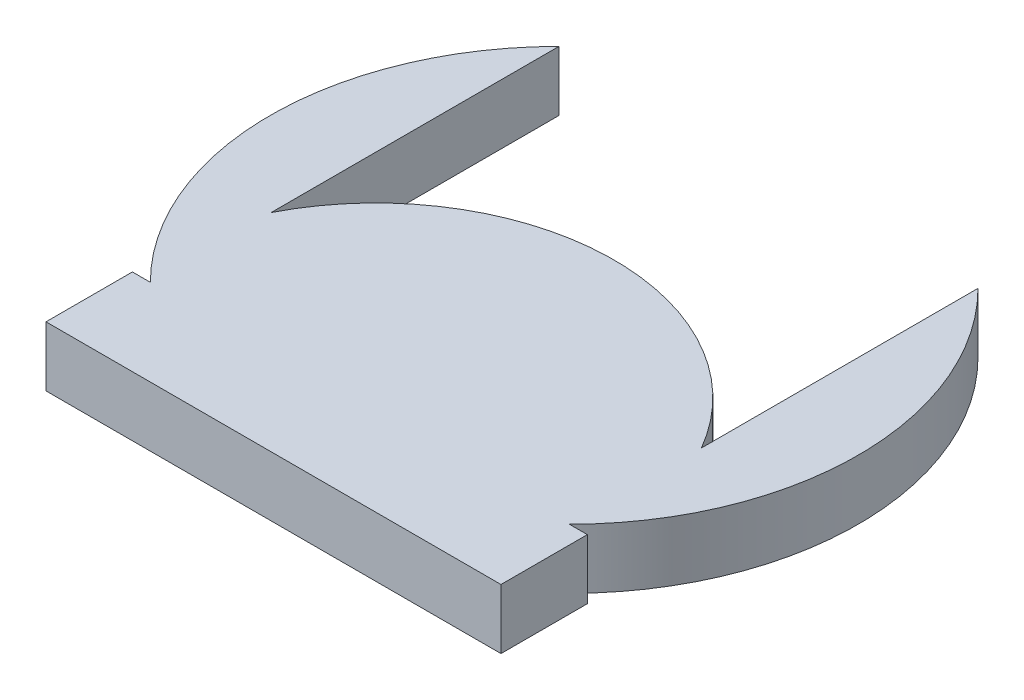
ISO-10303-21;
HEADER;
FILE_DESCRIPTION(('STEP AP214'),'2;1');
FILE_NAME('part.step','',(''),(''),'','','');
FILE_SCHEMA(('AUTOMOTIVE_DESIGN { 1 0 10303 214 1 1 1 1 }'));
ENDSEC;
DATA;
#1=APPLICATION_CONTEXT('core data for automotive mechanical design processes');
#2=APPLICATION_PROTOCOL_DEFINITION('international standard','automotive_design',2000,#1);
#3=PRODUCT_CONTEXT('',#1,'mechanical');
#4=PRODUCT('Part','Part','',(#3));
#5=PRODUCT_RELATED_PRODUCT_CATEGORY('part','',(#4));
#6=PRODUCT_DEFINITION_FORMATION('','',#4);
#7=PRODUCT_DEFINITION_CONTEXT('part definition',#1,'design');
#8=PRODUCT_DEFINITION('design','',#6,#7);
#9=PRODUCT_DEFINITION_SHAPE('','',#8);
#10=(LENGTH_UNIT() NAMED_UNIT(*) SI_UNIT(.MILLI.,.METRE.));
#11=(NAMED_UNIT(*) PLANE_ANGLE_UNIT() SI_UNIT($,.RADIAN.));
#12=(NAMED_UNIT(*) SI_UNIT($,.STERADIAN.) SOLID_ANGLE_UNIT());
#13=UNCERTAINTY_MEASURE_WITH_UNIT(LENGTH_MEASURE(1.E-05),#10,'distance_accuracy_value','');
#14=(GEOMETRIC_REPRESENTATION_CONTEXT(3) GLOBAL_UNCERTAINTY_ASSIGNED_CONTEXT((#13)) GLOBAL_UNIT_ASSIGNED_CONTEXT((#10,
#11,#12)) REPRESENTATION_CONTEXT('',''));
#15=CARTESIAN_POINT('',(0.,0.,0.));
#16=DIRECTION('',(0.,0.,1.));
#17=DIRECTION('',(1.,0.,0.));
#18=AXIS2_PLACEMENT_3D('',#15,#16,#17);
#19=CARTESIAN_POINT('',(-17.9365415986949,5.,-17.0634584013051));
#20=DIRECTION('',(0.,-1.,0.));
#21=DIRECTION('',(0.,0.,-1.));
#22=AXIS2_PLACEMENT_3D('',#19,#20,#21);
#23=CYLINDRICAL_SURFACE('',#22,24.1313742921147);
#24=CARTESIAN_POINT('',(-17.9365415986949,0.,-17.0634584013051));
#25=DIRECTION('',(0.,1.,0.));
#26=DIRECTION('',(0.,0.,1.));
#27=AXIS2_PLACEMENT_3D('',#24,#25,#26);
#28=CIRCLE('',#27,24.1313742921147);
#29=CARTESIAN_POINT('',(-35.,0.,0.));
#30=VERTEX_POINT('',#29);
#31=CARTESIAN_POINT('',(-35.,0.,-34.1269168026101));
#32=VERTEX_POINT('',#31);
#33=EDGE_CURVE('E127',#30,#32,#28,.F.);
#34=ORIENTED_EDGE('',*,*,#33,.F.);
#35=DIRECTION('',(0.,-1.,0.));
#36=VECTOR('',#35,1.);
#37=CARTESIAN_POINT('',(-35.,5.,0.));
#38=LINE('',#37,#36);
#39=CARTESIAN_POINT('',(-35.,5.,0.));
#40=VERTEX_POINT('',#39);
#41=EDGE_CURVE('E11',#40,#30,#38,.T.);
#42=ORIENTED_EDGE('',*,*,#41,.F.);
#43=CARTESIAN_POINT('',(-17.9365415986949,5.,-17.0634584013051));
#44=DIRECTION('',(0.,1.,0.));
#45=DIRECTION('',(0.,0.,1.));
#46=AXIS2_PLACEMENT_3D('',#43,#44,#45);
#47=CIRCLE('',#46,24.1313742921147);
#48=CARTESIAN_POINT('',(-35.,5.,-34.1269168026101));
#49=VERTEX_POINT('',#48);
#50=EDGE_CURVE('E164',#40,#49,#47,.F.);
#51=ORIENTED_EDGE('',*,*,#50,.T.);
#52=DIRECTION('',(0.,-1.,0.));
#53=VECTOR('',#52,1.);
#54=CARTESIAN_POINT('',(-35.,5.,-34.1269168026101));
#55=LINE('',#54,#53);
#56=EDGE_CURVE('E50',#49,#32,#55,.T.);
#57=ORIENTED_EDGE('',*,*,#56,.T.);
#58=EDGE_LOOP('',(#34,#42,#51,#57));
#59=FACE_BOUND('',#58,.T.);
#60=ADVANCED_FACE('F34',(#59),#23,.T.);
#61=CARTESIAN_POINT('',(-17.0634584013051,5.,-17.0634584013051));
#62=DIRECTION('',(0.,-1.,0.));
#63=DIRECTION('',(0.,0.,-1.));
#64=AXIS2_PLACEMENT_3D('',#61,#62,#63);
#65=CYLINDRICAL_SURFACE('',#64,24.1313742921147);
#66=CARTESIAN_POINT('',(-17.0634584013051,0.,-17.0634584013051));
#67=DIRECTION('',(0.,1.,0.));
#68=DIRECTION('',(0.,0.,1.));
#69=AXIS2_PLACEMENT_3D('',#66,#67,#68);
#70=CIRCLE('',#69,24.1313742921147);
#71=CARTESIAN_POINT('',(0.,0.,0.));
#72=VERTEX_POINT('',#71);
#73=CARTESIAN_POINT('',(0.,0.,-34.1269168026101));
#74=VERTEX_POINT('',#73);
#75=EDGE_CURVE('E176',#72,#74,#70,.T.);
#76=ORIENTED_EDGE('',*,*,#75,.T.);
#77=DIRECTION('',(0.,-1.,0.));
#78=VECTOR('',#77,1.);
#79=CARTESIAN_POINT('',(0.,5.,-34.1269168026101));
#80=LINE('',#79,#78);
#81=CARTESIAN_POINT('',(0.,5.,-34.1269168026101));
#82=VERTEX_POINT('',#81);
#83=EDGE_CURVE('E190',#82,#74,#80,.T.);
#84=ORIENTED_EDGE('',*,*,#83,.F.);
#85=CARTESIAN_POINT('',(-17.0634584013051,5.,-17.0634584013051));
#86=DIRECTION('',(0.,1.,0.));
#87=DIRECTION('',(0.,0.,1.));
#88=AXIS2_PLACEMENT_3D('',#85,#86,#87);
#89=CIRCLE('',#88,24.1313742921147);
#90=CARTESIAN_POINT('',(0.,5.,0.));
#91=VERTEX_POINT('',#90);
#92=EDGE_CURVE('E77',#91,#82,#89,.T.);
#93=ORIENTED_EDGE('',*,*,#92,.F.);
#94=DIRECTION('',(0.,-1.,0.));
#95=VECTOR('',#94,1.);
#96=CARTESIAN_POINT('',(0.,5.,0.));
#97=LINE('',#96,#95);
#98=EDGE_CURVE('E42',#91,#72,#97,.T.);
#99=ORIENTED_EDGE('',*,*,#98,.T.);
#100=EDGE_LOOP('',(#76,#84,#93,#99));
#101=FACE_BOUND('',#100,.T.);
#102=ADVANCED_FACE('F194',(#101),#65,.T.);
#103=CARTESIAN_POINT('',(0.,5.,0.));
#104=DIRECTION('',(1.,0.,0.));
#105=DIRECTION('',(0.,0.,-1.));
#106=AXIS2_PLACEMENT_3D('',#103,#104,#105);
#107=PLANE('',#106);
#108=DIRECTION('',(0.,0.,1.));
#109=VECTOR('',#108,1.);
#110=CARTESIAN_POINT('',(0.,0.,0.));
#111=LINE('',#110,#109);
#112=CARTESIAN_POINT('',(0.,0.,-11.0215334420881));
#113=VERTEX_POINT('',#112);
#114=EDGE_CURVE('E178',#74,#113,#111,.T.);
#115=ORIENTED_EDGE('',*,*,#114,.T.);
#116=DIRECTION('',(0.,-1.,0.));
#117=VECTOR('',#116,1.);
#118=CARTESIAN_POINT('',(0.,5.,-11.0215334420881));
#119=LINE('',#118,#117);
#120=CARTESIAN_POINT('',(0.,5.,-11.0215334420881));
#121=VERTEX_POINT('',#120);
#122=EDGE_CURVE('E188',#121,#113,#119,.T.);
#123=ORIENTED_EDGE('',*,*,#122,.F.);
#124=DIRECTION('',(0.,0.,1.));
#125=VECTOR('',#124,1.);
#126=CARTESIAN_POINT('',(0.,5.,0.));
#127=LINE('',#126,#125);
#128=EDGE_CURVE('E168',#82,#121,#127,.T.);
#129=ORIENTED_EDGE('',*,*,#128,.F.);
#130=ORIENTED_EDGE('',*,*,#83,.T.);
#131=EDGE_LOOP('',(#115,#123,#129,#130));
#132=FACE_BOUND('',#131,.T.);
#133=ADVANCED_FACE('F200',(#132),#107,.F.);
#134=CARTESIAN_POINT('',(-17.2480213658901,5.,-1.06887669687129));
#135=DIRECTION('',(0.,-1.,0.));
#136=DIRECTION('',(0.,0.,-1.));
#137=AXIS2_PLACEMENT_3D('',#134,#135,#136);
#138=CYLINDRICAL_SURFACE('',#137,19.9135536086935);
#139=CARTESIAN_POINT('',(-17.2480213658901,0.,-1.06887669687129));
#140=DIRECTION('',(0.,1.,0.));
#141=DIRECTION('',(0.,0.,1.));
#142=AXIS2_PLACEMENT_3D('',#139,#140,#141);
#143=CIRCLE('',#142,19.9135536086935);
#144=CARTESIAN_POINT('',(-35.,0.,-10.0920065252855));
#145=VERTEX_POINT('',#144);
#146=EDGE_CURVE('E181',#145,#113,#143,.F.);
#147=ORIENTED_EDGE('',*,*,#146,.F.);
#148=DIRECTION('',(0.,-1.,0.));
#149=VECTOR('',#148,1.);
#150=CARTESIAN_POINT('',(-35.,5.,-10.0920065252855));
#151=LINE('',#150,#149);
#152=CARTESIAN_POINT('',(-35.,5.,-10.0920065252855));
#153=VERTEX_POINT('',#152);
#154=EDGE_CURVE('E65',#153,#145,#151,.T.);
#155=ORIENTED_EDGE('',*,*,#154,.F.);
#156=CARTESIAN_POINT('',(-17.2480213658901,5.,-1.06887669687129));
#157=DIRECTION('',(0.,1.,0.));
#158=DIRECTION('',(0.,0.,1.));
#159=AXIS2_PLACEMENT_3D('',#156,#157,#158);
#160=CIRCLE('',#159,19.9135536086935);
#161=EDGE_CURVE('E170',#153,#121,#160,.F.);
#162=ORIENTED_EDGE('',*,*,#161,.T.);
#163=ORIENTED_EDGE('',*,*,#122,.T.);
#164=EDGE_LOOP('',(#147,#155,#162,#163));
#165=FACE_BOUND('',#164,.T.);
#166=ADVANCED_FACE('F209',(#165),#138,.T.);
#167=CARTESIAN_POINT('',(-35.,5.,0.));
#168=DIRECTION('',(1.,0.,0.));
#169=DIRECTION('',(0.,0.,-1.));
#170=AXIS2_PLACEMENT_3D('',#167,#168,#169);
#171=PLANE('',#170);
#172=DIRECTION('',(0.,0.,1.));
#173=VECTOR('',#172,1.);
#174=CARTESIAN_POINT('',(-35.,0.,0.));
#175=LINE('',#174,#173);
#176=EDGE_CURVE('E166',#32,#145,#175,.T.);
#177=ORIENTED_EDGE('',*,*,#176,.F.);
#178=ORIENTED_EDGE('',*,*,#56,.F.);
#179=DIRECTION('',(0.,0.,1.));
#180=VECTOR('',#179,1.);
#181=CARTESIAN_POINT('',(-35.,5.,0.));
#182=LINE('',#181,#180);
#183=EDGE_CURVE('E173',#49,#153,#182,.T.);
#184=ORIENTED_EDGE('',*,*,#183,.T.);
#185=ORIENTED_EDGE('',*,*,#154,.T.);
#186=EDGE_LOOP('',(#177,#178,#184,#185));
#187=FACE_BOUND('',#186,.T.);
#188=ADVANCED_FACE('F207',(#187),#171,.T.);
#189=CARTESIAN_POINT('',(0.,5.,0.));
#190=DIRECTION('',(0.,1.,0.));
#191=DIRECTION('',(0.,0.,1.));
#192=AXIS2_PLACEMENT_3D('',#189,#190,#191);
#193=PLANE('',#192);
#194=ORIENTED_EDGE('',*,*,#50,.F.);
#195=DIRECTION('',(-1.,0.,0.));
#196=VECTOR('',#195,1.);
#197=CARTESIAN_POINT('',(-35.,5.,0.));
#198=LINE('',#197,#196);
#199=CARTESIAN_POINT('',(-36.5,5.,0.));
#200=VERTEX_POINT('',#199);
#201=EDGE_CURVE('E148',#40,#200,#198,.T.);
#202=ORIENTED_EDGE('',*,*,#201,.T.);
#203=DIRECTION('',(0.,0.,1.));
#204=VECTOR('',#203,1.);
#205=CARTESIAN_POINT('',(-36.5,5.,0.));
#206=LINE('',#205,#204);
#207=CARTESIAN_POINT('',(-36.5,5.,7.21507126921497));
#208=VERTEX_POINT('',#207);
#209=EDGE_CURVE('E154',#200,#208,#206,.T.);
#210=ORIENTED_EDGE('',*,*,#209,.T.);
#211=DIRECTION('',(1.,0.,0.));
#212=VECTOR('',#211,1.);
#213=CARTESIAN_POINT('',(0.,5.,7.21507126921497));
#214=LINE('',#213,#212);
#215=CARTESIAN_POINT('',(1.49999999999999,5.,7.21507126921497));
#216=VERTEX_POINT('',#215);
#217=EDGE_CURVE('E128',#208,#216,#214,.T.);
#218=ORIENTED_EDGE('',*,*,#217,.T.);
#219=DIRECTION('',(0.,0.,-1.));
#220=VECTOR('',#219,1.);
#221=CARTESIAN_POINT('',(1.49999999999999,5.,0.));
#222=LINE('',#221,#220);
#223=CARTESIAN_POINT('',(1.49999999999999,5.,0.));
#224=VERTEX_POINT('',#223);
#225=EDGE_CURVE('E136',#216,#224,#222,.T.);
#226=ORIENTED_EDGE('',*,*,#225,.T.);
#227=DIRECTION('',(-1.,0.,0.));
#228=VECTOR('',#227,1.);
#229=CARTESIAN_POINT('',(0.,5.,0.));
#230=LINE('',#229,#228);
#231=EDGE_CURVE('E142',#224,#91,#230,.T.);
#232=ORIENTED_EDGE('',*,*,#231,.T.);
#233=ORIENTED_EDGE('',*,*,#92,.T.);
#234=ORIENTED_EDGE('',*,*,#128,.T.);
#235=ORIENTED_EDGE('',*,*,#161,.F.);
#236=ORIENTED_EDGE('',*,*,#183,.F.);
#237=EDGE_LOOP('',(#194,#202,#210,#218,#226,#232,#233,#234,#235,#236));
#238=FACE_BOUND('',#237,.T.);
#239=ADVANCED_FACE('F204',(#238),#193,.T.);
#240=CARTESIAN_POINT('',(0.,0.,0.));
#241=DIRECTION('',(0.,1.,0.));
#242=DIRECTION('',(0.,0.,1.));
#243=AXIS2_PLACEMENT_3D('',#240,#241,#242);
#244=PLANE('',#243);
#245=ORIENTED_EDGE('',*,*,#33,.T.);
#246=ORIENTED_EDGE('',*,*,#176,.T.);
#247=ORIENTED_EDGE('',*,*,#146,.T.);
#248=ORIENTED_EDGE('',*,*,#114,.F.);
#249=ORIENTED_EDGE('',*,*,#75,.F.);
#250=DIRECTION('',(-1.,0.,0.));
#251=VECTOR('',#250,1.);
#252=CARTESIAN_POINT('',(0.,0.,0.));
#253=LINE('',#252,#251);
#254=CARTESIAN_POINT('',(1.49999999999999,0.,0.));
#255=VERTEX_POINT('',#254);
#256=EDGE_CURVE('E138',#255,#72,#253,.T.);
#257=ORIENTED_EDGE('',*,*,#256,.F.);
#258=DIRECTION('',(0.,0.,-1.));
#259=VECTOR('',#258,1.);
#260=CARTESIAN_POINT('',(1.49999999999999,0.,0.));
#261=LINE('',#260,#259);
#262=CARTESIAN_POINT('',(1.49999999999999,0.,7.21507126921497));
#263=VERTEX_POINT('',#262);
#264=EDGE_CURVE('E133',#263,#255,#261,.T.);
#265=ORIENTED_EDGE('',*,*,#264,.F.);
#266=DIRECTION('',(1.,0.,0.));
#267=VECTOR('',#266,1.);
#268=CARTESIAN_POINT('',(0.,0.,7.21507126921497));
#269=LINE('',#268,#267);
#270=CARTESIAN_POINT('',(-36.5,0.,7.21507126921497));
#271=VERTEX_POINT('',#270);
#272=EDGE_CURVE('E116',#271,#263,#269,.T.);
#273=ORIENTED_EDGE('',*,*,#272,.F.);
#274=DIRECTION('',(0.,0.,1.));
#275=VECTOR('',#274,1.);
#276=CARTESIAN_POINT('',(-36.5,0.,0.));
#277=LINE('',#276,#275);
#278=CARTESIAN_POINT('',(-36.5,0.,0.));
#279=VERTEX_POINT('',#278);
#280=EDGE_CURVE('E153',#279,#271,#277,.T.);
#281=ORIENTED_EDGE('',*,*,#280,.F.);
#282=DIRECTION('',(-1.,0.,0.));
#283=VECTOR('',#282,1.);
#284=CARTESIAN_POINT('',(-35.,0.,0.));
#285=LINE('',#284,#283);
#286=EDGE_CURVE('E150',#30,#279,#285,.T.);
#287=ORIENTED_EDGE('',*,*,#286,.F.);
#288=EDGE_LOOP('',(#245,#246,#247,#248,#249,#257,#265,#273,#281,#287));
#289=FACE_BOUND('',#288,.T.);
#290=ADVANCED_FACE('F140',(#289),#244,.F.);
#291=CARTESIAN_POINT('',(0.,0.,7.21507126921497));
#292=DIRECTION('',(0.,0.,1.));
#293=DIRECTION('',(1.,0.,0.));
#294=AXIS2_PLACEMENT_3D('',#291,#292,#293);
#295=PLANE('',#294);
#296=ORIENTED_EDGE('',*,*,#217,.F.);
#297=DIRECTION('',(0.,1.,0.));
#298=VECTOR('',#297,1.);
#299=CARTESIAN_POINT('',(-36.5,0.,7.21507126921497));
#300=LINE('',#299,#298);
#301=EDGE_CURVE('E122',#271,#208,#300,.T.);
#302=ORIENTED_EDGE('',*,*,#301,.F.);
#303=ORIENTED_EDGE('',*,*,#272,.T.);
#304=DIRECTION('',(0.,1.,0.));
#305=VECTOR('',#304,1.);
#306=CARTESIAN_POINT('',(1.49999999999999,0.,7.21507126921497));
#307=LINE('',#306,#305);
#308=EDGE_CURVE('E119',#263,#216,#307,.T.);
#309=ORIENTED_EDGE('',*,*,#308,.T.);
#310=EDGE_LOOP('',(#296,#302,#303,#309));
#311=FACE_BOUND('',#310,.T.);
#312=ADVANCED_FACE('F118',(#311),#295,.T.);
#313=CARTESIAN_POINT('',(-36.5,0.,0.));
#314=DIRECTION('',(-1.,0.,0.));
#315=DIRECTION('',(0.,0.,1.));
#316=AXIS2_PLACEMENT_3D('',#313,#314,#315);
#317=PLANE('',#316);
#318=ORIENTED_EDGE('',*,*,#209,.F.);
#319=DIRECTION('',(0.,1.,0.));
#320=VECTOR('',#319,1.);
#321=CARTESIAN_POINT('',(-36.5,0.,0.));
#322=LINE('',#321,#320);
#323=EDGE_CURVE('E156',#279,#200,#322,.T.);
#324=ORIENTED_EDGE('',*,*,#323,.F.);
#325=ORIENTED_EDGE('',*,*,#280,.T.);
#326=ORIENTED_EDGE('',*,*,#301,.T.);
#327=EDGE_LOOP('',(#318,#324,#325,#326));
#328=FACE_BOUND('',#327,.T.);
#329=ADVANCED_FACE('F228',(#328),#317,.T.);
#330=CARTESIAN_POINT('',(-35.,0.,0.));
#331=DIRECTION('',(0.,0.,-1.));
#332=DIRECTION('',(-1.,0.,0.));
#333=AXIS2_PLACEMENT_3D('',#330,#331,#332);
#334=PLANE('',#333);
#335=ORIENTED_EDGE('',*,*,#201,.F.);
#336=ORIENTED_EDGE('',*,*,#41,.T.);
#337=ORIENTED_EDGE('',*,*,#286,.T.);
#338=ORIENTED_EDGE('',*,*,#323,.T.);
#339=EDGE_LOOP('',(#335,#336,#337,#338));
#340=FACE_BOUND('',#339,.T.);
#341=ADVANCED_FACE('F225',(#340),#334,.T.);
#342=CARTESIAN_POINT('',(0.,0.,0.));
#343=DIRECTION('',(0.,0.,-1.));
#344=DIRECTION('',(-1.,0.,0.));
#345=AXIS2_PLACEMENT_3D('',#342,#343,#344);
#346=PLANE('',#345);
#347=ORIENTED_EDGE('',*,*,#231,.F.);
#348=DIRECTION('',(0.,1.,0.));
#349=VECTOR('',#348,1.);
#350=CARTESIAN_POINT('',(1.49999999999999,0.,0.));
#351=LINE('',#350,#349);
#352=EDGE_CURVE('E137',#255,#224,#351,.T.);
#353=ORIENTED_EDGE('',*,*,#352,.F.);
#354=ORIENTED_EDGE('',*,*,#256,.T.);
#355=ORIENTED_EDGE('',*,*,#98,.F.);
#356=EDGE_LOOP('',(#347,#353,#354,#355));
#357=FACE_BOUND('',#356,.T.);
#358=ADVANCED_FACE('F235',(#357),#346,.T.);
#359=CARTESIAN_POINT('',(1.49999999999999,0.,0.));
#360=DIRECTION('',(1.,0.,0.));
#361=DIRECTION('',(0.,0.,-1.));
#362=AXIS2_PLACEMENT_3D('',#359,#360,#361);
#363=PLANE('',#362);
#364=ORIENTED_EDGE('',*,*,#225,.F.);
#365=ORIENTED_EDGE('',*,*,#308,.F.);
#366=ORIENTED_EDGE('',*,*,#264,.T.);
#367=ORIENTED_EDGE('',*,*,#352,.T.);
#368=EDGE_LOOP('',(#364,#365,#366,#367));
#369=FACE_BOUND('',#368,.T.);
#370=ADVANCED_FACE('F132',(#369),#363,.T.);
#371=CLOSED_SHELL('',(#60,#102,#133,#166,#188,#239,#290,#312,#329,#341,#358,#370));
#372=MANIFOLD_SOLID_BREP('B2',#371);
#373=ADVANCED_BREP_SHAPE_REPRESENTATION('',(#18,#372),#14);
#374=SHAPE_DEFINITION_REPRESENTATION(#9,#373);
ENDSEC;
END-ISO-10303-21;
